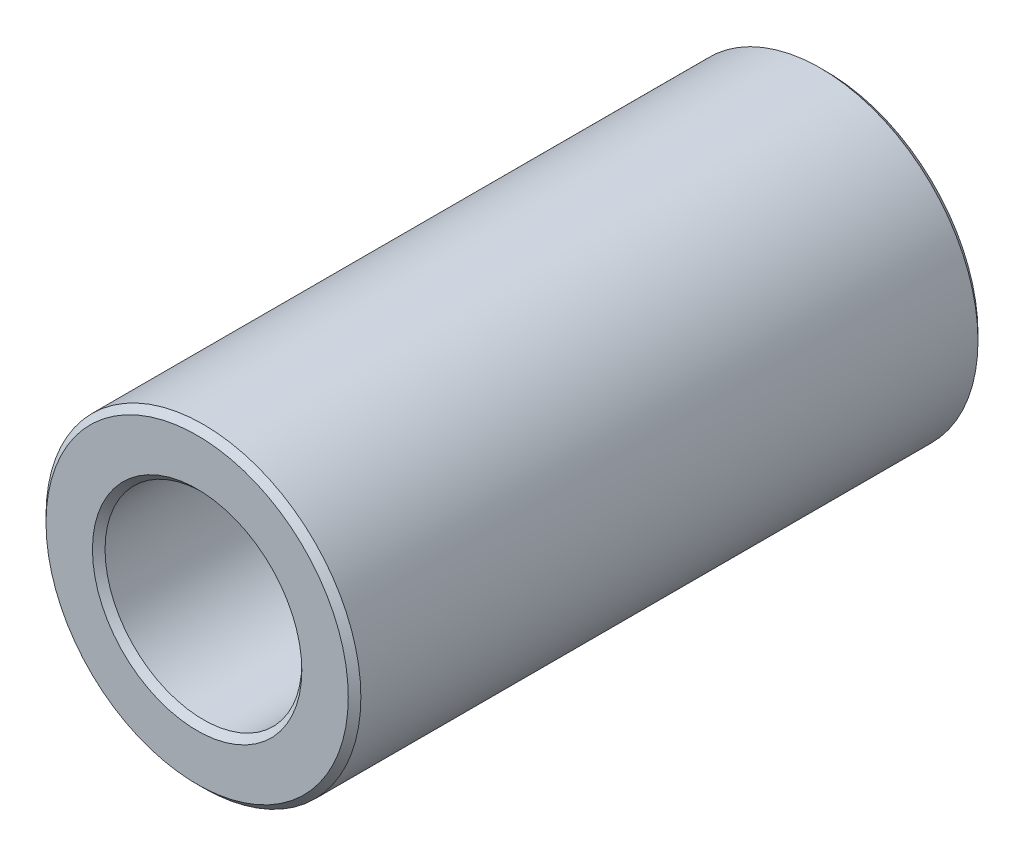
ISO-10303-21;
HEADER;
FILE_DESCRIPTION(('STEP AP214'),'2;1');
FILE_NAME('part.step','',(''),(''),'','','');
FILE_SCHEMA(('AUTOMOTIVE_DESIGN { 1 0 10303 214 1 1 1 1 }'));
ENDSEC;
DATA;
#1=APPLICATION_CONTEXT('core data for automotive mechanical design processes');
#2=APPLICATION_PROTOCOL_DEFINITION('international standard','automotive_design',2000,#1);
#3=PRODUCT_CONTEXT('',#1,'mechanical');
#4=PRODUCT('Part','Part','',(#3));
#5=PRODUCT_RELATED_PRODUCT_CATEGORY('part','',(#4));
#6=PRODUCT_DEFINITION_FORMATION('','',#4);
#7=PRODUCT_DEFINITION_CONTEXT('part definition',#1,'design');
#8=PRODUCT_DEFINITION('design','',#6,#7);
#9=PRODUCT_DEFINITION_SHAPE('','',#8);
#10=(LENGTH_UNIT() NAMED_UNIT(*) SI_UNIT(.MILLI.,.METRE.));
#11=(NAMED_UNIT(*) PLANE_ANGLE_UNIT() SI_UNIT($,.RADIAN.));
#12=(NAMED_UNIT(*) SI_UNIT($,.STERADIAN.) SOLID_ANGLE_UNIT());
#13=UNCERTAINTY_MEASURE_WITH_UNIT(LENGTH_MEASURE(1.E-05),#10,'distance_accuracy_value','');
#14=(GEOMETRIC_REPRESENTATION_CONTEXT(3) GLOBAL_UNCERTAINTY_ASSIGNED_CONTEXT((#13)) GLOBAL_UNIT_ASSIGNED_CONTEXT((#10,
#11,#12)) REPRESENTATION_CONTEXT('',''));
#15=CARTESIAN_POINT('',(0.,0.,0.));
#16=DIRECTION('',(0.,0.,1.));
#17=DIRECTION('',(1.,0.,0.));
#18=AXIS2_PLACEMENT_3D('',#15,#16,#17);
#19=CARTESIAN_POINT('',(0.,3.96875,0.));
#20=DIRECTION('',(0.,0.,-1.));
#21=DIRECTION('',(-1.,0.,0.));
#22=AXIS2_PLACEMENT_3D('',#19,#20,#21);
#23=PLANE('',#22);
#24=CARTESIAN_POINT('',(0.,0.,0.));
#25=DIRECTION('',(0.,0.,-1.));
#26=DIRECTION('',(-1.,0.,0.));
#27=AXIS2_PLACEMENT_3D('',#24,#25,#26);
#28=CIRCLE('',#27,6.09600000000001);
#29=CARTESIAN_POINT('',(-6.09600000000001,0.,0.));
#30=VERTEX_POINT('',#29);
#31=EDGE_CURVE('E69',#30,#30,#28,.F.);
#32=ORIENTED_EDGE('',*,*,#31,.T.);
#33=EDGE_LOOP('',(#32));
#34=FACE_BOUND('',#33,.T.);
#35=CARTESIAN_POINT('',(0.,0.,0.));
#36=DIRECTION('',(0.,0.,-1.));
#37=DIRECTION('',(-1.,0.,0.));
#38=AXIS2_PLACEMENT_3D('',#35,#36,#37);
#39=CIRCLE('',#38,4.22275);
#40=CARTESIAN_POINT('',(-4.22275,0.,0.));
#41=VERTEX_POINT('',#40);
#42=EDGE_CURVE('E72',#41,#41,#39,.T.);
#43=ORIENTED_EDGE('',*,*,#42,.T.);
#44=EDGE_LOOP('',(#43));
#45=FACE_BOUND('',#44,.T.);
#46=ADVANCED_FACE('F50',(#34,#45),#23,.F.);
#47=CARTESIAN_POINT('',(0.,0.,0.));
#48=DIRECTION('',(0.,0.,1.));
#49=DIRECTION('',(1.,0.,0.));
#50=AXIS2_PLACEMENT_3D('',#47,#48,#49);
#51=CYLINDRICAL_SURFACE('',#50,6.35);
#52=CARTESIAN_POINT('',(0.,0.,-25.146));
#53=DIRECTION('',(0.,0.,1.));
#54=DIRECTION('',(1.,0.,0.));
#55=AXIS2_PLACEMENT_3D('',#52,#53,#54);
#56=CIRCLE('',#55,6.35);
#57=CARTESIAN_POINT('',(6.35,0.,-25.146));
#58=VERTEX_POINT('',#57);
#59=EDGE_CURVE('E81',#58,#58,#56,.T.);
#60=ORIENTED_EDGE('',*,*,#59,.T.);
#61=EDGE_LOOP('',(#60));
#62=FACE_BOUND('',#61,.T.);
#63=CARTESIAN_POINT('',(0.,0.,-0.253999999999991));
#64=DIRECTION('',(0.,0.,-1.));
#65=DIRECTION('',(-1.,0.,0.));
#66=AXIS2_PLACEMENT_3D('',#63,#64,#65);
#67=CIRCLE('',#66,6.35);
#68=CARTESIAN_POINT('',(-6.35,0.,-0.253999999999991));
#69=VERTEX_POINT('',#68);
#70=EDGE_CURVE('E84',#69,#69,#67,.T.);
#71=ORIENTED_EDGE('',*,*,#70,.T.);
#72=EDGE_LOOP('',(#71));
#73=FACE_BOUND('',#72,.T.);
#74=ADVANCED_FACE('F107',(#62,#73),#51,.T.);
#75=CARTESIAN_POINT('',(0.,6.35,-25.4));
#76=DIRECTION('',(0.,0.,1.));
#77=DIRECTION('',(1.,0.,0.));
#78=AXIS2_PLACEMENT_3D('',#75,#76,#77);
#79=PLANE('',#78);
#80=CARTESIAN_POINT('',(0.,0.,-25.4));
#81=DIRECTION('',(0.,0.,1.));
#82=DIRECTION('',(1.,0.,0.));
#83=AXIS2_PLACEMENT_3D('',#80,#81,#82);
#84=CIRCLE('',#83,6.09599999999999);
#85=CARTESIAN_POINT('',(6.09599999999999,0.,-25.4));
#86=VERTEX_POINT('',#85);
#87=EDGE_CURVE('E75',#86,#86,#84,.F.);
#88=ORIENTED_EDGE('',*,*,#87,.T.);
#89=EDGE_LOOP('',(#88));
#90=FACE_BOUND('',#89,.T.);
#91=CARTESIAN_POINT('',(0.,0.,-25.4));
#92=DIRECTION('',(0.,0.,1.));
#93=DIRECTION('',(1.,0.,0.));
#94=AXIS2_PLACEMENT_3D('',#91,#92,#93);
#95=CIRCLE('',#94,4.9276);
#96=CARTESIAN_POINT('',(4.9276,0.,-25.4));
#97=VERTEX_POINT('',#96);
#98=EDGE_CURVE('E78',#97,#97,#95,.T.);
#99=ORIENTED_EDGE('',*,*,#98,.T.);
#100=EDGE_LOOP('',(#99));
#101=FACE_BOUND('',#100,.T.);
#102=ADVANCED_FACE('F103',(#90,#101),#79,.F.);
#103=CARTESIAN_POINT('',(0.,0.,0.));
#104=DIRECTION('',(0.,0.,1.));
#105=DIRECTION('',(1.,0.,0.));
#106=AXIS2_PLACEMENT_3D('',#103,#104,#105);
#107=CYLINDRICAL_SURFACE('',#106,4.6736);
#108=CARTESIAN_POINT('',(0.,0.,-25.146));
#109=DIRECTION('',(0.,0.,1.));
#110=DIRECTION('',(1.,0.,0.));
#111=AXIS2_PLACEMENT_3D('',#108,#109,#110);
#112=CIRCLE('',#111,4.6736);
#113=CARTESIAN_POINT('',(4.6736,0.,-25.146));
#114=VERTEX_POINT('',#113);
#115=EDGE_CURVE('E60',#114,#114,#112,.F.);
#116=ORIENTED_EDGE('',*,*,#115,.T.);
#117=EDGE_LOOP('',(#116));
#118=FACE_BOUND('',#117,.T.);
#119=CARTESIAN_POINT('',(0.,0.,-15.24));
#120=DIRECTION('',(0.,0.,1.));
#121=DIRECTION('',(1.,0.,0.));
#122=AXIS2_PLACEMENT_3D('',#119,#120,#121);
#123=CIRCLE('',#122,4.6736);
#124=CARTESIAN_POINT('',(4.6736,0.,-15.24));
#125=VERTEX_POINT('',#124);
#126=EDGE_CURVE('E87',#125,#125,#123,.T.);
#127=ORIENTED_EDGE('',*,*,#126,.T.);
#128=EDGE_LOOP('',(#127));
#129=FACE_BOUND('',#128,.T.);
#130=ADVANCED_FACE('F91',(#118,#129),#107,.F.);
#131=CARTESIAN_POINT('',(0.,4.6736,-15.24));
#132=DIRECTION('',(0.,0.,1.));
#133=DIRECTION('',(1.,0.,0.));
#134=AXIS2_PLACEMENT_3D('',#131,#132,#133);
#135=PLANE('',#134);
#136=CARTESIAN_POINT('',(0.,0.,-15.24));
#137=DIRECTION('',(0.,0.,1.));
#138=DIRECTION('',(1.,0.,0.));
#139=AXIS2_PLACEMENT_3D('',#136,#137,#138);
#140=CIRCLE('',#139,4.09575);
#141=CARTESIAN_POINT('',(4.09575,0.,-15.24));
#142=VERTEX_POINT('',#141);
#143=EDGE_CURVE('E56',#142,#142,#140,.T.);
#144=ORIENTED_EDGE('',*,*,#143,.T.);
#145=EDGE_LOOP('',(#144));
#146=FACE_BOUND('',#145,.T.);
#147=ORIENTED_EDGE('',*,*,#126,.F.);
#148=EDGE_LOOP('',(#147));
#149=FACE_BOUND('',#148,.T.);
#150=ADVANCED_FACE('F93',(#146,#149),#135,.F.);
#151=CARTESIAN_POINT('',(0.,0.,0.));
#152=DIRECTION('',(0.,0.,1.));
#153=DIRECTION('',(1.,0.,0.));
#154=AXIS2_PLACEMENT_3D('',#151,#152,#153);
#155=CYLINDRICAL_SURFACE('',#154,3.96875);
#156=CARTESIAN_POINT('',(0.,0.,-15.113));
#157=DIRECTION('',(0.,0.,1.));
#158=DIRECTION('',(1.,0.,0.));
#159=AXIS2_PLACEMENT_3D('',#156,#157,#158);
#160=CIRCLE('',#159,3.96875);
#161=CARTESIAN_POINT('',(3.96875,0.,-15.113));
#162=VERTEX_POINT('',#161);
#163=EDGE_CURVE('E11',#162,#162,#160,.F.);
#164=ORIENTED_EDGE('',*,*,#163,.T.);
#165=EDGE_LOOP('',(#164));
#166=FACE_BOUND('',#165,.T.);
#167=CARTESIAN_POINT('',(0.,0.,-0.253999999999997));
#168=DIRECTION('',(0.,0.,-1.));
#169=DIRECTION('',(-1.,0.,0.));
#170=AXIS2_PLACEMENT_3D('',#167,#168,#169);
#171=CIRCLE('',#170,3.96875);
#172=CARTESIAN_POINT('',(-3.96875,0.,-0.253999999999997));
#173=VERTEX_POINT('',#172);
#174=EDGE_CURVE('E64',#173,#173,#171,.F.);
#175=ORIENTED_EDGE('',*,*,#174,.T.);
#176=EDGE_LOOP('',(#175));
#177=FACE_BOUND('',#176,.T.);
#178=ADVANCED_FACE('F95',(#166,#177),#155,.F.);
#179=CARTESIAN_POINT('',(0.,0.,-25.146));
#180=DIRECTION('',(0.,0.,1.));
#181=DIRECTION('',(1.,0.,0.));
#182=AXIS2_PLACEMENT_3D('',#179,#180,#181);
#183=CONICAL_SURFACE('',#182,6.35,0.78539816339745);
#184=ORIENTED_EDGE('',*,*,#87,.F.);
#185=EDGE_LOOP('',(#184));
#186=FACE_BOUND('',#185,.T.);
#187=ORIENTED_EDGE('',*,*,#59,.F.);
#188=EDGE_LOOP('',(#187));
#189=FACE_BOUND('',#188,.T.);
#190=ADVANCED_FACE('F101',(#186,#189),#183,.T.);
#191=CARTESIAN_POINT('',(0.,0.,0.));
#192=DIRECTION('',(0.,0.,-1.));
#193=DIRECTION('',(-1.,0.,0.));
#194=AXIS2_PLACEMENT_3D('',#191,#192,#193);
#195=CONICAL_SURFACE('',#194,6.09600000000001,0.785398163397447);
#196=ORIENTED_EDGE('',*,*,#70,.F.);
#197=EDGE_LOOP('',(#196));
#198=FACE_BOUND('',#197,.T.);
#199=ORIENTED_EDGE('',*,*,#31,.F.);
#200=EDGE_LOOP('',(#199));
#201=FACE_BOUND('',#200,.T.);
#202=ADVANCED_FACE('F121',(#198,#201),#195,.T.);
#203=CARTESIAN_POINT('',(0.,0.,-0.253999999999997));
#204=DIRECTION('',(0.,0.,1.));
#205=DIRECTION('',(1.,0.,0.));
#206=AXIS2_PLACEMENT_3D('',#203,#204,#205);
#207=CONICAL_SURFACE('',#206,3.96875,0.78539816339745);
#208=ORIENTED_EDGE('',*,*,#42,.F.);
#209=EDGE_LOOP('',(#208));
#210=FACE_BOUND('',#209,.T.);
#211=ORIENTED_EDGE('',*,*,#174,.F.);
#212=EDGE_LOOP('',(#211));
#213=FACE_BOUND('',#212,.T.);
#214=ADVANCED_FACE('F117',(#210,#213),#207,.F.);
#215=CARTESIAN_POINT('',(0.,0.,-25.4));
#216=DIRECTION('',(0.,0.,-1.));
#217=DIRECTION('',(-1.,0.,0.));
#218=AXIS2_PLACEMENT_3D('',#215,#216,#217);
#219=CONICAL_SURFACE('',#218,4.9276,0.785398163397448);
#220=ORIENTED_EDGE('',*,*,#115,.F.);
#221=EDGE_LOOP('',(#220));
#222=FACE_BOUND('',#221,.T.);
#223=ORIENTED_EDGE('',*,*,#98,.F.);
#224=EDGE_LOOP('',(#223));
#225=FACE_BOUND('',#224,.T.);
#226=ADVANCED_FACE('F120',(#222,#225),#219,.F.);
#227=CARTESIAN_POINT('',(0.,0.,-15.24));
#228=DIRECTION('',(0.,0.,-1.));
#229=DIRECTION('',(-1.,0.,0.));
#230=AXIS2_PLACEMENT_3D('',#227,#228,#229);
#231=CONICAL_SURFACE('',#230,4.09575,0.785398163397438);
#232=ORIENTED_EDGE('',*,*,#163,.F.);
#233=EDGE_LOOP('',(#232));
#234=FACE_BOUND('',#233,.T.);
#235=ORIENTED_EDGE('',*,*,#143,.F.);
#236=EDGE_LOOP('',(#235));
#237=FACE_BOUND('',#236,.T.);
#238=ADVANCED_FACE('F129',(#234,#237),#231,.F.);
#239=CLOSED_SHELL('',(#46,#74,#102,#130,#150,#178,#190,#202,#214,#226,#238));
#240=MANIFOLD_SOLID_BREP('B2',#239);
#241=ADVANCED_BREP_SHAPE_REPRESENTATION('',(#18,#240),#14);
#242=SHAPE_DEFINITION_REPRESENTATION(#9,#241);
ENDSEC;
END-ISO-10303-21;
